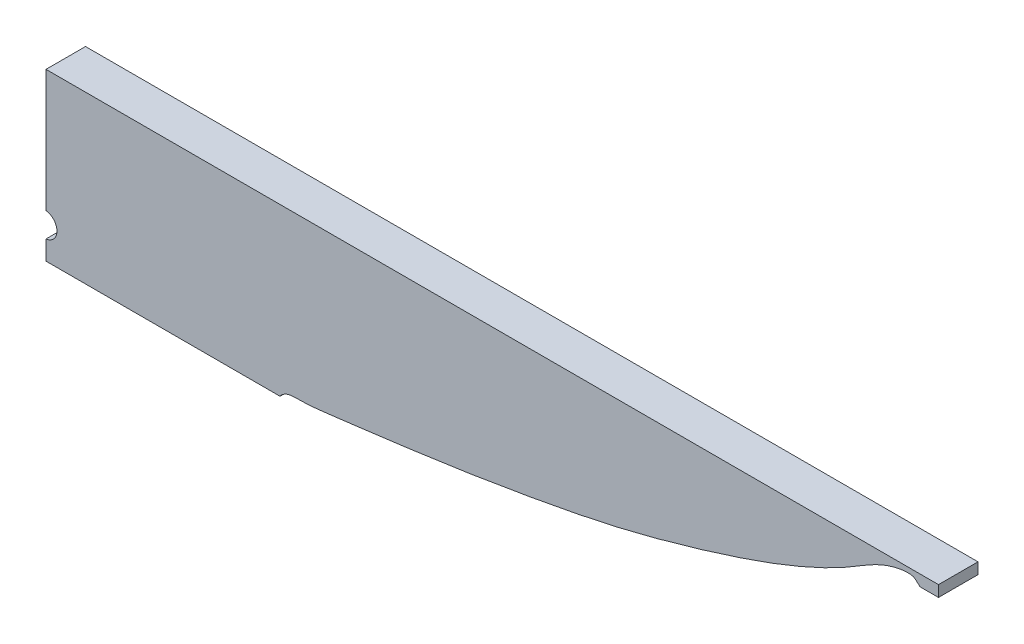
ISO-10303-21;
HEADER;
FILE_DESCRIPTION(('STEP AP214'),'2;1');
FILE_NAME('part.step','',(''),(''),'','','');
FILE_SCHEMA(('AUTOMOTIVE_DESIGN { 1 0 10303 214 1 1 1 1 }'));
ENDSEC;
DATA;
#1=APPLICATION_CONTEXT('core data for automotive mechanical design processes');
#2=APPLICATION_PROTOCOL_DEFINITION('international standard','automotive_design',2000,#1);
#3=PRODUCT_CONTEXT('',#1,'mechanical');
#4=PRODUCT('Part','Part','',(#3));
#5=PRODUCT_RELATED_PRODUCT_CATEGORY('part','',(#4));
#6=PRODUCT_DEFINITION_FORMATION('','',#4);
#7=PRODUCT_DEFINITION_CONTEXT('part definition',#1,'design');
#8=PRODUCT_DEFINITION('design','',#6,#7);
#9=PRODUCT_DEFINITION_SHAPE('','',#8);
#10=(LENGTH_UNIT() NAMED_UNIT(*) SI_UNIT(.MILLI.,.METRE.));
#11=(NAMED_UNIT(*) PLANE_ANGLE_UNIT() SI_UNIT($,.RADIAN.));
#12=(NAMED_UNIT(*) SI_UNIT($,.STERADIAN.) SOLID_ANGLE_UNIT());
#13=UNCERTAINTY_MEASURE_WITH_UNIT(LENGTH_MEASURE(1.E-05),#10,'distance_accuracy_value','');
#14=(GEOMETRIC_REPRESENTATION_CONTEXT(3) GLOBAL_UNCERTAINTY_ASSIGNED_CONTEXT((#13)) GLOBAL_UNIT_ASSIGNED_CONTEXT((#10,
#11,#12)) REPRESENTATION_CONTEXT('',''));
#15=CARTESIAN_POINT('',(0.,0.,0.));
#16=DIRECTION('',(0.,0.,1.));
#17=DIRECTION('',(1.,0.,0.));
#18=AXIS2_PLACEMENT_3D('',#15,#16,#17);
#19=CARTESIAN_POINT('',(-99.715552913143,-31.3833561952627,340.));
#20=DIRECTION('',(1.,0.,0.));
#21=DIRECTION('',(0.,1.,0.));
#22=AXIS2_PLACEMENT_3D('',#19,#20,#21);
#23=PLANE('',#22);
#24=DIRECTION('',(0.,-1.,0.));
#25=VECTOR('',#24,1.);
#26=CARTESIAN_POINT('',(-99.715552913143,-31.3833561952627,332.));
#27=LINE('',#26,#25);
#28=CARTESIAN_POINT('',(-99.7155529131445,2.25600000000002,332.));
#29=VERTEX_POINT('',#28);
#30=CARTESIAN_POINT('',(-99.7155529131434,-22.5162347424165,332.));
#31=VERTEX_POINT('',#30);
#32=EDGE_CURVE('E249',#29,#31,#27,.T.);
#33=ORIENTED_EDGE('',*,*,#32,.T.);
#34=DIRECTION('',(0.,0.,1.));
#35=VECTOR('',#34,1.);
#36=CARTESIAN_POINT('',(-99.7155529131434,-22.5162347424165,308.));
#37=LINE('',#36,#35);
#38=CARTESIAN_POINT('',(-99.7155529131434,-22.5162347424165,340.));
#39=VERTEX_POINT('',#38);
#40=EDGE_CURVE('E48',#31,#39,#37,.T.);
#41=ORIENTED_EDGE('',*,*,#40,.T.);
#42=DIRECTION('',(0.,-1.,0.));
#43=VECTOR('',#42,1.);
#44=CARTESIAN_POINT('',(-99.715552913143,-31.3833561952627,340.));
#45=LINE('',#44,#43);
#46=CARTESIAN_POINT('',(-99.7155529131445,2.25600000000002,340.));
#47=VERTEX_POINT('',#46);
#48=EDGE_CURVE('E110',#47,#39,#45,.T.);
#49=ORIENTED_EDGE('',*,*,#48,.F.);
#50=DIRECTION('',(0.,0.,-1.));
#51=VECTOR('',#50,1.);
#52=CARTESIAN_POINT('',(-99.7155529131445,2.25600000000002,340.));
#53=LINE('',#52,#51);
#54=EDGE_CURVE('E118',#47,#29,#53,.T.);
#55=ORIENTED_EDGE('',*,*,#54,.T.);
#56=EDGE_LOOP('',(#33,#41,#49,#55));
#57=FACE_BOUND('',#56,.T.);
#58=ADVANCED_FACE('F30',(#57),#23,.F.);
#59=CARTESIAN_POINT('',(-52.3272502786354,-31.3827697241907,340.));
#60=CARTESIAN_POINT('',(-52.3019884324153,-31.2969959954433,340.));
#61=CARTESIAN_POINT('',(-52.2510294920231,-31.2214637600181,340.));
#62=CARTESIAN_POINT('',(-52.1306502574105,-31.090701118863,340.));
#63=CARTESIAN_POINT('',(-52.0631045876463,-31.0327108940605,340.));
#64=CARTESIAN_POINT('',(-51.8576423509928,-30.8623788784455,340.));
#65=CARTESIAN_POINT('',(-51.7199084373645,-30.7498702787553,340.));
#66=CARTESIAN_POINT('',(-51.426859378234,-30.5490812323631,340.));
#67=CARTESIAN_POINT('',(-51.2709453750391,-30.4588355837759,340.));
#68=CARTESIAN_POINT('',(-50.9481445110749,-30.3195746832623,340.));
#69=CARTESIAN_POINT('',(-50.7813729098261,-30.2672465714669,340.));
#70=CARTESIAN_POINT('',(-50.2703245053053,-30.14483876575,340.));
#71=CARTESIAN_POINT('',(-49.9157778011306,-30.1079661032342,340.));
#72=CARTESIAN_POINT('',(-49.212680404316,-30.0630187397424,340.));
#73=CARTESIAN_POINT('',(-48.8603808214018,-30.0575005290863,340.));
#74=CARTESIAN_POINT('',(-48.1556154953519,-30.050216115977,340.));
#75=CARTESIAN_POINT('',(-47.8032070134301,-30.045812950502,340.));
#76=CARTESIAN_POINT('',(-47.0995059227388,-30.0208724890715,340.));
#77=CARTESIAN_POINT('',(-46.7480740175179,-30.0027163720569,340.));
#78=CARTESIAN_POINT('',(-45.6949487993763,-29.9323505581936,340.));
#79=CARTESIAN_POINT('',(-44.9944962056809,-29.8632896614089,340.));
#80=CARTESIAN_POINT('',(-43.5950006136815,-29.7060230256475,340.));
#81=CARTESIAN_POINT('',(-42.8961027312229,-29.6201713744207,340.));
#82=CARTESIAN_POINT('',(-41.4980174461401,-29.4510897010541,340.));
#83=CARTESIAN_POINT('',(-40.7990741939679,-29.3657342211435,340.));
#84=CARTESIAN_POINT('',(-38.7026197819837,-29.1065913074638,340.));
#85=CARTESIAN_POINT('',(-37.3054828160542,-28.9297260793651,340.));
#86=CARTESIAN_POINT('',(-30.3203126993804,-28.0415688005213,340.));
#87=CARTESIAN_POINT('',(-24.7328662119518,-27.3235012531114,340.));
#88=CARTESIAN_POINT('',(-16.3694038635395,-26.1203051056439,340.));
#89=CARTESIAN_POINT('',(-13.5847645751322,-25.6971272198141,340.));
#90=CARTESIAN_POINT('',(-8.02374958291194,-24.802751810992,340.));
#91=CARTESIAN_POINT('',(-5.24692142333589,-24.3332639725061,340.));
#92=CARTESIAN_POINT('',(0.300801715395404,-23.3583278125374,340.));
#93=CARTESIAN_POINT('',(3.0717862145152,-22.8532016858624,340.));
#94=CARTESIAN_POINT('',(8.60129266739322,-21.7841953682263,340.));
#95=CARTESIAN_POINT('',(11.3598853814276,-21.2194371193625,340.));
#96=CARTESIAN_POINT('',(16.8571147145289,-19.9919136036226,340.));
#97=CARTESIAN_POINT('',(19.5954808987058,-19.3280654266205,340.));
#98=CARTESIAN_POINT('',(25.0442670796501,-17.9056169306788,340.));
#99=CARTESIAN_POINT('',(27.7562073613432,-17.1485075816995,340.));
#100=CARTESIAN_POINT('',(33.1621733381757,-15.5682786664374,340.));
#101=CARTESIAN_POINT('',(35.8555168853719,-14.7422863430019,340.));
#102=CARTESIAN_POINT('',(41.2146464856652,-13.0075678728659,340.));
#103=CARTESIAN_POINT('',(43.8821393008736,-12.101339766008,340.));
#104=CARTESIAN_POINT('',(47.8466984728157,-10.6432138819539,340.));
#105=CARTESIAN_POINT('',(49.1628016640629,-10.1400909763772,340.));
#106=CARTESIAN_POINT('',(51.775823690343,-9.09161315919485,340.));
#107=CARTESIAN_POINT('',(53.0718838434992,-8.54591149351347,340.));
#108=CARTESIAN_POINT('',(55.6433578940863,-7.41210729063058,340.));
#109=CARTESIAN_POINT('',(56.919014684114,-6.82450357790945,340.));
#110=CARTESIAN_POINT('',(59.4434073906102,-5.59400920280514,340.));
#111=CARTESIAN_POINT('',(60.6918170069734,-4.95044842332999,340.));
#112=CARTESIAN_POINT('',(62.5333153984651,-3.92120477527265,340.));
#113=CARTESIAN_POINT('',(63.1421489651842,-3.56785672295101,340.));
#114=CARTESIAN_POINT('',(64.3545654694534,-2.85037748863225,340.));
#115=CARTESIAN_POINT('',(64.9573385805393,-2.48454769977814,340.));
#116=CARTESIAN_POINT('',(66.7709210505985,-1.39812943723909,340.));
#117=CARTESIAN_POINT('',(67.9883408901442,-0.691611535507576,340.));
#118=CARTESIAN_POINT('',(69.915274346982,0.154130829341781,340.));
#119=CARTESIAN_POINT('',(70.5750215093673,0.399023417192298,340.));
#120=CARTESIAN_POINT('',(71.591258217337,0.709849150694,340.));
#121=CARTESIAN_POINT('',(71.935365580292,0.8045941353554,340.));
#122=CARTESIAN_POINT('',(72.6265336896471,0.971732304141805,340.));
#123=CARTESIAN_POINT('',(72.9737903956955,1.04391888817592,340.));
#124=CARTESIAN_POINT('',(73.6721209127614,1.16231641096693,340.));
#125=CARTESIAN_POINT('',(74.0231429335477,1.20887978558425,340.));
#126=CARTESIAN_POINT('',(74.5554494103909,1.23943617774483,340.));
#127=CARTESIAN_POINT('',(74.7338086857951,1.24333523812031,340.));
#128=CARTESIAN_POINT('',(75.0927894856767,1.23573860815497,340.));
#129=CARTESIAN_POINT('',(75.2715585356191,1.22354384403631,340.));
#130=CARTESIAN_POINT('',(75.6240193159501,1.16902089234046,340.));
#131=CARTESIAN_POINT('',(75.8007121559411,1.12515059816222,340.));
#132=CARTESIAN_POINT('',(76.1310343218241,0.986553759106768,340.));
#133=CARTESIAN_POINT('',(76.2805633356021,0.889113688015156,340.));
#134=CARTESIAN_POINT('',(76.5626221993794,0.664580013545955,340.));
#135=CARTESIAN_POINT('',(76.6914801589952,0.539175678150931,340.));
#136=CARTESIAN_POINT('',(76.8904638789848,0.357218097927206,340.));
#137=CARTESIAN_POINT('',(76.9570095269587,0.29680059419744,340.));
#138=CARTESIAN_POINT('',(77.0778595877811,0.162752788784381,340.));
#139=CARTESIAN_POINT('',(77.1291278446639,0.0871817104850022,340.));
#140=CARTESIAN_POINT('',(77.1546689252611,0.,340.));
#141=B_SPLINE_CURVE_WITH_KNOTS('',3,(#59,#60,#61,#62,#63,#64,#65,#66,#67,#68,#69,#70,#71,#72,
#73,#74,#75,#76,#77,#78,#79,#80,#81,#82,#83,#84,#85,#86,#87,#88,#89,#90,#91,#92,#93,#94,#95,#96,
#97,#98,#99,#100,#101,#102,#103,#104,#105,#106,#107,#108,#109,#110,#111,#112,#113,#114,#115,
#116,#117,#118,#119,#120,#121,#122,#123,#124,#125,#126,#127,#128,#129,#130,#131,#132,#133,#134,
#135,#136,#137,#138,#139,#140),.UNSPECIFIED.,.F.,.F.,(4,2,2,2,2,2,2,2,2,2,2,2,2,2,2,2,2,2,2,2,2,
2,2,2,2,2,2,2,2,2,2,2,2,2,2,2,2,2,2,2,4),(0.,0.00195312500000011,0.00390625000000022,
0.00781250000000022,0.0117187500000002,0.0156250000000002,0.0234375000000001,0.03125,
0.0390624999999999,0.0468749999999998,0.0624999999999998,0.0781249999999998,0.0937499999999998,
0.125,0.25,0.3125,0.375,0.4375,0.499999999999999,0.562499999999999,0.624999999999999,
0.687499999999999,0.75,0.78125,0.8125,0.84375,0.875,0.890625,0.90625,0.9375,0.953125,0.9609375,
0.96875,0.9765625,0.98046875,0.984375,0.98828125,0.9921875,0.99609375,0.998046875,1.),.UNSPECIFIED.);
#142=DIRECTION('',(0.,0.,-1.));
#143=VECTOR('',#142,1.);
#144=SURFACE_OF_LINEAR_EXTRUSION('',#141,#143);
#145=CARTESIAN_POINT('',(-52.3272502786354,-31.3827697241907,332.));
#146=CARTESIAN_POINT('',(-52.3019884324153,-31.2969959954433,332.));
#147=CARTESIAN_POINT('',(-52.2510294920231,-31.2214637600181,332.));
#148=CARTESIAN_POINT('',(-52.1306502574105,-31.090701118863,332.));
#149=CARTESIAN_POINT('',(-52.0631045876463,-31.0327108940605,332.));
#150=CARTESIAN_POINT('',(-51.8576423509928,-30.8623788784455,332.));
#151=CARTESIAN_POINT('',(-51.7199084373645,-30.7498702787553,332.));
#152=CARTESIAN_POINT('',(-51.426859378234,-30.5490812323631,332.));
#153=CARTESIAN_POINT('',(-51.2709453750391,-30.4588355837759,332.));
#154=CARTESIAN_POINT('',(-50.9481445110749,-30.3195746832623,332.));
#155=CARTESIAN_POINT('',(-50.7813729098261,-30.2672465714669,332.));
#156=CARTESIAN_POINT('',(-50.2703245053053,-30.14483876575,332.));
#157=CARTESIAN_POINT('',(-49.9157778011306,-30.1079661032342,332.));
#158=CARTESIAN_POINT('',(-49.212680404316,-30.0630187397424,332.));
#159=CARTESIAN_POINT('',(-48.8603808214018,-30.0575005290863,332.));
#160=CARTESIAN_POINT('',(-48.1556154953519,-30.050216115977,332.));
#161=CARTESIAN_POINT('',(-47.8032070134301,-30.045812950502,332.));
#162=CARTESIAN_POINT('',(-47.0995059227388,-30.0208724890715,332.));
#163=CARTESIAN_POINT('',(-46.7480740175179,-30.0027163720569,332.));
#164=CARTESIAN_POINT('',(-45.6949487993763,-29.9323505581936,332.));
#165=CARTESIAN_POINT('',(-44.9944962056809,-29.8632896614089,332.));
#166=CARTESIAN_POINT('',(-43.5950006136815,-29.7060230256475,332.));
#167=CARTESIAN_POINT('',(-42.8961027312229,-29.6201713744207,332.));
#168=CARTESIAN_POINT('',(-41.4980174461401,-29.4510897010541,332.));
#169=CARTESIAN_POINT('',(-40.7990741939679,-29.3657342211435,332.));
#170=CARTESIAN_POINT('',(-38.7026197819837,-29.1065913074638,332.));
#171=CARTESIAN_POINT('',(-37.3054828160542,-28.9297260793651,332.));
#172=CARTESIAN_POINT('',(-30.3203126993804,-28.0415688005213,332.));
#173=CARTESIAN_POINT('',(-24.7328662119518,-27.3235012531114,332.));
#174=CARTESIAN_POINT('',(-16.3694038635395,-26.1203051056439,332.));
#175=CARTESIAN_POINT('',(-13.5847645751322,-25.6971272198141,332.));
#176=CARTESIAN_POINT('',(-8.02374958291194,-24.802751810992,332.));
#177=CARTESIAN_POINT('',(-5.24692142333589,-24.3332639725061,332.));
#178=CARTESIAN_POINT('',(0.300801715395404,-23.3583278125374,332.));
#179=CARTESIAN_POINT('',(3.0717862145152,-22.8532016858624,332.));
#180=CARTESIAN_POINT('',(8.60129266739322,-21.7841953682263,332.));
#181=CARTESIAN_POINT('',(11.3598853814276,-21.2194371193625,332.));
#182=CARTESIAN_POINT('',(16.8571147145289,-19.9919136036226,332.));
#183=CARTESIAN_POINT('',(19.5954808987058,-19.3280654266205,332.));
#184=CARTESIAN_POINT('',(25.0442670796501,-17.9056169306788,332.));
#185=CARTESIAN_POINT('',(27.7562073613432,-17.1485075816995,332.));
#186=CARTESIAN_POINT('',(33.1621733381757,-15.5682786664374,332.));
#187=CARTESIAN_POINT('',(35.8555168853719,-14.7422863430019,332.));
#188=CARTESIAN_POINT('',(41.2146464856652,-13.0075678728659,332.));
#189=CARTESIAN_POINT('',(43.8821393008736,-12.101339766008,332.));
#190=CARTESIAN_POINT('',(47.8466984728157,-10.6432138819539,332.));
#191=CARTESIAN_POINT('',(49.1628016640629,-10.1400909763772,332.));
#192=CARTESIAN_POINT('',(51.775823690343,-9.09161315919485,332.));
#193=CARTESIAN_POINT('',(53.0718838434992,-8.54591149351347,332.));
#194=CARTESIAN_POINT('',(55.6433578940863,-7.41210729063058,332.));
#195=CARTESIAN_POINT('',(56.919014684114,-6.82450357790945,332.));
#196=CARTESIAN_POINT('',(59.4434073906102,-5.59400920280514,332.));
#197=CARTESIAN_POINT('',(60.6918170069734,-4.95044842332999,332.));
#198=CARTESIAN_POINT('',(62.5333153984651,-3.92120477527265,332.));
#199=CARTESIAN_POINT('',(63.1421489651842,-3.56785672295101,332.));
#200=CARTESIAN_POINT('',(64.3545654694534,-2.85037748863225,332.));
#201=CARTESIAN_POINT('',(64.9573385805393,-2.48454769977814,332.));
#202=CARTESIAN_POINT('',(66.7709210505985,-1.39812943723909,332.));
#203=CARTESIAN_POINT('',(67.9883408901442,-0.691611535507576,332.));
#204=CARTESIAN_POINT('',(69.915274346982,0.154130829341781,332.));
#205=CARTESIAN_POINT('',(70.5750215093673,0.399023417192298,332.));
#206=CARTESIAN_POINT('',(71.591258217337,0.709849150694,332.));
#207=CARTESIAN_POINT('',(71.935365580292,0.8045941353554,332.));
#208=CARTESIAN_POINT('',(72.6265336896471,0.971732304141805,332.));
#209=CARTESIAN_POINT('',(72.9737903956955,1.04391888817592,332.));
#210=CARTESIAN_POINT('',(73.6721209127614,1.16231641096693,332.));
#211=CARTESIAN_POINT('',(74.0231429335477,1.20887978558425,332.));
#212=CARTESIAN_POINT('',(74.5554494103909,1.23943617774483,332.));
#213=CARTESIAN_POINT('',(74.7338086857951,1.24333523812031,332.));
#214=CARTESIAN_POINT('',(75.0927894856767,1.23573860815497,332.));
#215=CARTESIAN_POINT('',(75.2715585356191,1.22354384403631,332.));
#216=CARTESIAN_POINT('',(75.6240193159501,1.16902089234046,332.));
#217=CARTESIAN_POINT('',(75.8007121559411,1.12515059816222,332.));
#218=CARTESIAN_POINT('',(76.1310343218241,0.986553759106768,332.));
#219=CARTESIAN_POINT('',(76.2805633356021,0.889113688015156,332.));
#220=CARTESIAN_POINT('',(76.5626221993794,0.664580013545955,332.));
#221=CARTESIAN_POINT('',(76.6914801589952,0.539175678150931,332.));
#222=CARTESIAN_POINT('',(76.8904638789848,0.357218097927206,332.));
#223=CARTESIAN_POINT('',(76.9570095269587,0.29680059419744,332.));
#224=CARTESIAN_POINT('',(77.0778595877811,0.162752788784381,332.));
#225=CARTESIAN_POINT('',(77.1291278446639,0.0871817104850022,332.));
#226=CARTESIAN_POINT('',(77.1546689252611,0.,332.));
#227=B_SPLINE_CURVE_WITH_KNOTS('',3,(#145,#146,#147,#148,#149,#150,#151,#152,#153,#154,#155,
#156,#157,#158,#159,#160,#161,#162,#163,#164,#165,#166,#167,#168,#169,#170,#171,#172,#173,#174,
#175,#176,#177,#178,#179,#180,#181,#182,#183,#184,#185,#186,#187,#188,#189,#190,#191,#192,#193,
#194,#195,#196,#197,#198,#199,#200,#201,#202,#203,#204,#205,#206,#207,#208,#209,#210,#211,#212,
#213,#214,#215,#216,#217,#218,#219,#220,#221,#222,#223,#224,#225,#226),.UNSPECIFIED.,.F.,.F.,(4,
2,2,2,2,2,2,2,2,2,2,2,2,2,2,2,2,2,2,2,2,2,2,2,2,2,2,2,2,2,2,2,2,2,2,2,2,2,2,2,4),(0.,
0.00195312500000011,0.00390625000000022,0.00781250000000022,0.0117187500000002,
0.0156250000000002,0.0234375000000001,0.03125,0.0390624999999999,0.0468749999999998,
0.0624999999999998,0.0781249999999998,0.0937499999999998,0.125,0.25,0.3125,0.375,0.4375,
0.499999999999999,0.562499999999999,0.624999999999999,0.687499999999999,0.75,0.78125,0.8125,
0.84375,0.875,0.890625,0.90625,0.9375,0.953125,0.9609375,0.96875,0.9765625,0.98046875,0.984375,
0.98828125,0.9921875,0.99609375,0.998046875,1.),.UNSPECIFIED.);
#228=CARTESIAN_POINT('',(-52.3272502786354,-31.3827697241907,332.));
#229=VERTEX_POINT('',#228);
#230=CARTESIAN_POINT('',(77.1546689252631,1.49874009687176E-13,332.));
#231=VERTEX_POINT('',#230);
#232=EDGE_CURVE('E227',#229,#231,#227,.T.);
#233=ORIENTED_EDGE('',*,*,#232,.T.);
#234=DIRECTION('',(0.,0.,-1.));
#235=VECTOR('',#234,1.);
#236=CARTESIAN_POINT('',(77.1546689252631,1.49874009687176E-13,340.));
#237=LINE('',#236,#235);
#238=CARTESIAN_POINT('',(77.1546689252631,1.49874009687176E-13,340.));
#239=VERTEX_POINT('',#238);
#240=EDGE_CURVE('E42',#239,#231,#237,.T.);
#241=ORIENTED_EDGE('',*,*,#240,.F.);
#242=CARTESIAN_POINT('',(77.1546689252611,0.,340.));
#243=CARTESIAN_POINT('',(77.1291278446639,0.0871817104850022,340.));
#244=CARTESIAN_POINT('',(77.0778595877811,0.162752788784381,340.));
#245=CARTESIAN_POINT('',(76.9570095269587,0.29680059419744,340.));
#246=CARTESIAN_POINT('',(76.8904638789848,0.357218097927206,340.));
#247=CARTESIAN_POINT('',(76.6914801589952,0.539175678150931,340.));
#248=CARTESIAN_POINT('',(76.5626221993794,0.664580013545955,340.));
#249=CARTESIAN_POINT('',(76.2805633356021,0.889113688015156,340.));
#250=CARTESIAN_POINT('',(76.1310343218241,0.986553759106768,340.));
#251=CARTESIAN_POINT('',(75.8007121559411,1.12515059816222,340.));
#252=CARTESIAN_POINT('',(75.6240193159501,1.16902089234046,340.));
#253=CARTESIAN_POINT('',(75.2715585356191,1.22354384403631,340.));
#254=CARTESIAN_POINT('',(75.0927894856767,1.23573860815497,340.));
#255=CARTESIAN_POINT('',(74.7338086857951,1.24333523812031,340.));
#256=CARTESIAN_POINT('',(74.5554494103909,1.23943617774483,340.));
#257=CARTESIAN_POINT('',(74.0231429335477,1.20887978558425,340.));
#258=CARTESIAN_POINT('',(73.6721209127614,1.16231641096693,340.));
#259=CARTESIAN_POINT('',(72.9737903956955,1.04391888817592,340.));
#260=CARTESIAN_POINT('',(72.6265336896471,0.971732304141805,340.));
#261=CARTESIAN_POINT('',(71.935365580292,0.8045941353554,340.));
#262=CARTESIAN_POINT('',(71.591258217337,0.709849150694,340.));
#263=CARTESIAN_POINT('',(70.5750215093673,0.399023417192298,340.));
#264=CARTESIAN_POINT('',(69.915274346982,0.154130829341781,340.));
#265=CARTESIAN_POINT('',(67.9883408901442,-0.691611535507576,340.));
#266=CARTESIAN_POINT('',(66.7709210505985,-1.39812943723909,340.));
#267=CARTESIAN_POINT('',(64.9573385805393,-2.48454769977814,340.));
#268=CARTESIAN_POINT('',(64.3545654694534,-2.85037748863225,340.));
#269=CARTESIAN_POINT('',(63.1421489651842,-3.56785672295101,340.));
#270=CARTESIAN_POINT('',(62.5333153984651,-3.92120477527265,340.));
#271=CARTESIAN_POINT('',(60.6918170069734,-4.95044842332999,340.));
#272=CARTESIAN_POINT('',(59.4434073906102,-5.59400920280514,340.));
#273=CARTESIAN_POINT('',(56.919014684114,-6.82450357790945,340.));
#274=CARTESIAN_POINT('',(55.6433578940863,-7.41210729063058,340.));
#275=CARTESIAN_POINT('',(53.0718838434992,-8.54591149351347,340.));
#276=CARTESIAN_POINT('',(51.775823690343,-9.09161315919485,340.));
#277=CARTESIAN_POINT('',(49.1628016640629,-10.1400909763772,340.));
#278=CARTESIAN_POINT('',(47.8466984728157,-10.6432138819539,340.));
#279=CARTESIAN_POINT('',(43.8821393008736,-12.101339766008,340.));
#280=CARTESIAN_POINT('',(41.2146464856652,-13.0075678728659,340.));
#281=CARTESIAN_POINT('',(35.8555168853719,-14.7422863430019,340.));
#282=CARTESIAN_POINT('',(33.1621733381757,-15.5682786664374,340.));
#283=CARTESIAN_POINT('',(27.7562073613432,-17.1485075816995,340.));
#284=CARTESIAN_POINT('',(25.0442670796501,-17.9056169306788,340.));
#285=CARTESIAN_POINT('',(19.5954808987058,-19.3280654266205,340.));
#286=CARTESIAN_POINT('',(16.8571147145289,-19.9919136036226,340.));
#287=CARTESIAN_POINT('',(11.3598853814276,-21.2194371193625,340.));
#288=CARTESIAN_POINT('',(8.60129266739322,-21.7841953682263,340.));
#289=CARTESIAN_POINT('',(3.0717862145152,-22.8532016858624,340.));
#290=CARTESIAN_POINT('',(0.300801715395404,-23.3583278125374,340.));
#291=CARTESIAN_POINT('',(-5.24692142333589,-24.3332639725061,340.));
#292=CARTESIAN_POINT('',(-8.02374958291194,-24.802751810992,340.));
#293=CARTESIAN_POINT('',(-13.5847645751322,-25.6971272198141,340.));
#294=CARTESIAN_POINT('',(-16.3694038635395,-26.1203051056439,340.));
#295=CARTESIAN_POINT('',(-24.7328662119518,-27.3235012531114,340.));
#296=CARTESIAN_POINT('',(-30.3203126993804,-28.0415688005213,340.));
#297=CARTESIAN_POINT('',(-37.3054828160542,-28.9297260793651,340.));
#298=CARTESIAN_POINT('',(-38.7026197819837,-29.1065913074638,340.));
#299=CARTESIAN_POINT('',(-40.7990741939679,-29.3657342211435,340.));
#300=CARTESIAN_POINT('',(-41.4980174461401,-29.4510897010541,340.));
#301=CARTESIAN_POINT('',(-42.8961027312229,-29.6201713744207,340.));
#302=CARTESIAN_POINT('',(-43.5950006136815,-29.7060230256475,340.));
#303=CARTESIAN_POINT('',(-44.9944962056809,-29.8632896614089,340.));
#304=CARTESIAN_POINT('',(-45.6949487993763,-29.9323505581936,340.));
#305=CARTESIAN_POINT('',(-46.7480740175179,-30.0027163720569,340.));
#306=CARTESIAN_POINT('',(-47.0995059227388,-30.0208724890715,340.));
#307=CARTESIAN_POINT('',(-47.8032070134301,-30.045812950502,340.));
#308=CARTESIAN_POINT('',(-48.1556154953519,-30.050216115977,340.));
#309=CARTESIAN_POINT('',(-48.8603808214018,-30.0575005290863,340.));
#310=CARTESIAN_POINT('',(-49.212680404316,-30.0630187397424,340.));
#311=CARTESIAN_POINT('',(-49.9157778011306,-30.1079661032342,340.));
#312=CARTESIAN_POINT('',(-50.2703245053053,-30.14483876575,340.));
#313=CARTESIAN_POINT('',(-50.7813729098261,-30.2672465714669,340.));
#314=CARTESIAN_POINT('',(-50.9481445110749,-30.3195746832623,340.));
#315=CARTESIAN_POINT('',(-51.2709453750391,-30.4588355837759,340.));
#316=CARTESIAN_POINT('',(-51.426859378234,-30.5490812323631,340.));
#317=CARTESIAN_POINT('',(-51.7199084373645,-30.7498702787553,340.));
#318=CARTESIAN_POINT('',(-51.8576423509928,-30.8623788784455,340.));
#319=CARTESIAN_POINT('',(-52.0631045876463,-31.0327108940605,340.));
#320=CARTESIAN_POINT('',(-52.1306502574105,-31.090701118863,340.));
#321=CARTESIAN_POINT('',(-52.2510294920231,-31.2214637600181,340.));
#322=CARTESIAN_POINT('',(-52.3019884324153,-31.2969959954433,340.));
#323=CARTESIAN_POINT('',(-52.3272502786354,-31.3827697241907,340.));
#324=B_SPLINE_CURVE_WITH_KNOTS('',3,(#242,#243,#244,#245,#246,#247,#248,#249,#250,#251,#252,
#253,#254,#255,#256,#257,#258,#259,#260,#261,#262,#263,#264,#265,#266,#267,#268,#269,#270,#271,
#272,#273,#274,#275,#276,#277,#278,#279,#280,#281,#282,#283,#284,#285,#286,#287,#288,#289,#290,
#291,#292,#293,#294,#295,#296,#297,#298,#299,#300,#301,#302,#303,#304,#305,#306,#307,#308,#309,
#310,#311,#312,#313,#314,#315,#316,#317,#318,#319,#320,#321,#322,#323),.UNSPECIFIED.,.F.,.F.,(4,
2,2,2,2,2,2,2,2,2,2,2,2,2,2,2,2,2,2,2,2,2,2,2,2,2,2,2,2,2,2,2,2,2,2,2,2,2,2,2,4),(0.,
0.001953125,0.00390625,0.0078125,0.01171875,0.015625,0.01953125,0.0234375,0.03125,0.0390625,
0.046875,0.0625,0.09375,0.109375,0.125,0.15625,0.1875,0.21875,0.25,0.312500000000001,
0.375000000000001,0.437500000000001,0.500000000000001,0.5625,0.625,0.6875,0.75,0.875,0.90625,
0.921875,0.9375,0.953125,0.9609375,0.96875,0.9765625,0.984375,0.98828125,0.9921875,0.99609375,
0.998046875,1.),.UNSPECIFIED.);
#325=CARTESIAN_POINT('',(-52.3272502786354,-31.3827697241907,340.));
#326=VERTEX_POINT('',#325);
#327=EDGE_CURVE('E209',#326,#239,#324,.F.);
#328=ORIENTED_EDGE('',*,*,#327,.F.);
#329=DIRECTION('',(0.,0.,-1.));
#330=VECTOR('',#329,1.);
#331=CARTESIAN_POINT('',(-52.3272502786354,-31.3827697241907,340.));
#332=LINE('',#331,#330);
#333=EDGE_CURVE('E129',#326,#229,#332,.T.);
#334=ORIENTED_EDGE('',*,*,#333,.T.);
#335=EDGE_LOOP('',(#233,#241,#328,#334));
#336=FACE_BOUND('',#335,.T.);
#337=ADVANCED_FACE('F32',(#336),#144,.F.);
#338=CARTESIAN_POINT('',(77.1546689252631,1.49874009687176E-13,340.));
#339=DIRECTION('',(0.,1.,0.));
#340=DIRECTION('',(-1.,0.,0.));
#341=AXIS2_PLACEMENT_3D('',#338,#339,#340);
#342=PLANE('',#341);
#343=DIRECTION('',(1.,0.,0.));
#344=VECTOR('',#343,1.);
#345=CARTESIAN_POINT('',(77.1546689252631,1.49874009687176E-13,332.));
#346=LINE('',#345,#344);
#347=CARTESIAN_POINT('',(80.9999285185176,0.,332.));
#348=VERTEX_POINT('',#347);
#349=EDGE_CURVE('E175',#231,#348,#346,.T.);
#350=ORIENTED_EDGE('',*,*,#349,.T.);
#351=DIRECTION('',(0.,0.,-1.));
#352=VECTOR('',#351,1.);
#353=CARTESIAN_POINT('',(80.9999285185176,0.,340.));
#354=LINE('',#353,#352);
#355=CARTESIAN_POINT('',(80.9999285185176,0.,340.));
#356=VERTEX_POINT('',#355);
#357=EDGE_CURVE('E179',#356,#348,#354,.T.);
#358=ORIENTED_EDGE('',*,*,#357,.F.);
#359=DIRECTION('',(1.,0.,0.));
#360=VECTOR('',#359,1.);
#361=CARTESIAN_POINT('',(77.1546689252631,1.49874009687176E-13,340.));
#362=LINE('',#361,#360);
#363=EDGE_CURVE('E95',#239,#356,#362,.T.);
#364=ORIENTED_EDGE('',*,*,#363,.F.);
#365=ORIENTED_EDGE('',*,*,#240,.T.);
#366=EDGE_LOOP('',(#350,#358,#364,#365));
#367=FACE_BOUND('',#366,.T.);
#368=ADVANCED_FACE('F260',(#367),#342,.F.);
#369=CARTESIAN_POINT('',(80.9999285185176,2.25600000000004,340.));
#370=DIRECTION('',(-1.,0.,0.));
#371=DIRECTION('',(0.,-1.,0.));
#372=AXIS2_PLACEMENT_3D('',#369,#370,#371);
#373=PLANE('',#372);
#374=DIRECTION('',(0.,1.,0.));
#375=VECTOR('',#374,1.);
#376=CARTESIAN_POINT('',(80.9999285185176,2.25600000000004,332.));
#377=LINE('',#376,#375);
#378=CARTESIAN_POINT('',(80.9999285185176,2.25600000000004,332.));
#379=VERTEX_POINT('',#378);
#380=EDGE_CURVE('E170',#348,#379,#377,.T.);
#381=ORIENTED_EDGE('',*,*,#380,.T.);
#382=DIRECTION('',(0.,0.,-1.));
#383=VECTOR('',#382,1.);
#384=CARTESIAN_POINT('',(80.9999285185176,2.25600000000004,340.));
#385=LINE('',#384,#383);
#386=CARTESIAN_POINT('',(80.9999285185176,2.25600000000004,340.));
#387=VERTEX_POINT('',#386);
#388=EDGE_CURVE('E125',#387,#379,#385,.T.);
#389=ORIENTED_EDGE('',*,*,#388,.F.);
#390=DIRECTION('',(0.,1.,0.));
#391=VECTOR('',#390,1.);
#392=CARTESIAN_POINT('',(80.9999285185176,2.25600000000004,340.));
#393=LINE('',#392,#391);
#394=EDGE_CURVE('E112',#356,#387,#393,.T.);
#395=ORIENTED_EDGE('',*,*,#394,.F.);
#396=ORIENTED_EDGE('',*,*,#357,.T.);
#397=EDGE_LOOP('',(#381,#389,#395,#396));
#398=FACE_BOUND('',#397,.T.);
#399=ADVANCED_FACE('F263',(#398),#373,.F.);
#400=CARTESIAN_POINT('',(80.9999285185176,2.25600000000004,340.));
#401=DIRECTION('',(0.,-1.,0.));
#402=DIRECTION('',(1.,0.,0.));
#403=AXIS2_PLACEMENT_3D('',#400,#401,#402);
#404=PLANE('',#403);
#405=DIRECTION('',(-1.,0.,0.));
#406=VECTOR('',#405,1.);
#407=CARTESIAN_POINT('',(80.9999285185176,2.25600000000004,332.));
#408=LINE('',#407,#406);
#409=EDGE_CURVE('E121',#379,#29,#408,.T.);
#410=ORIENTED_EDGE('',*,*,#409,.T.);
#411=ORIENTED_EDGE('',*,*,#54,.F.);
#412=DIRECTION('',(-1.,0.,0.));
#413=VECTOR('',#412,1.);
#414=CARTESIAN_POINT('',(80.9999285185176,2.25600000000004,340.));
#415=LINE('',#414,#413);
#416=EDGE_CURVE('E105',#387,#47,#415,.T.);
#417=ORIENTED_EDGE('',*,*,#416,.F.);
#418=ORIENTED_EDGE('',*,*,#388,.T.);
#419=EDGE_LOOP('',(#410,#411,#417,#418));
#420=FACE_BOUND('',#419,.T.);
#421=ADVANCED_FACE('F119',(#420),#404,.F.);
#422=CARTESIAN_POINT('',(-99.7155529131432,-27.4837652575835,340.));
#423=VERTEX_POINT('',#422);
#424=CARTESIAN_POINT('',(-99.715552913143,-31.3833561952627,340.));
#425=VERTEX_POINT('',#424);
#426=EDGE_CURVE('E36',#423,#425,#45,.T.);
#427=ORIENTED_EDGE('',*,*,#426,.F.);
#428=DIRECTION('',(0.,0.,1.));
#429=VECTOR('',#428,1.);
#430=CARTESIAN_POINT('',(-99.7155529131432,-27.4837652575835,308.));
#431=LINE('',#430,#429);
#432=CARTESIAN_POINT('',(-99.7155529131432,-27.4837652575835,332.));
#433=VERTEX_POINT('',#432);
#434=EDGE_CURVE('E269',#423,#433,#431,.F.);
#435=ORIENTED_EDGE('',*,*,#434,.T.);
#436=CARTESIAN_POINT('',(-99.715552913143,-31.3833561952627,332.));
#437=VERTEX_POINT('',#436);
#438=EDGE_CURVE('E176',#433,#437,#27,.T.);
#439=ORIENTED_EDGE('',*,*,#438,.T.);
#440=DIRECTION('',(0.,0.,-1.));
#441=VECTOR('',#440,1.);
#442=CARTESIAN_POINT('',(-99.715552913143,-31.3833561952627,340.));
#443=LINE('',#442,#441);
#444=EDGE_CURVE('E126',#425,#437,#443,.T.);
#445=ORIENTED_EDGE('',*,*,#444,.F.);
#446=EDGE_LOOP('',(#427,#435,#439,#445));
#447=FACE_BOUND('',#446,.T.);
#448=ADVANCED_FACE('F159',(#447),#23,.F.);
#449=CARTESIAN_POINT('',(-99.7155529131445,-31.383356195265,340.));
#450=CARTESIAN_POINT('',(-83.919452034935,-31.3835484393856,340.));
#451=CARTESIAN_POINT('',(-68.1233511387106,-31.3835506609957,340.));
#452=CARTESIAN_POINT('',(-52.3272502786354,-31.3827697241907,340.));
#453=B_SPLINE_CURVE_WITH_KNOTS('',3,(#449,#450,#451,#452),.UNSPECIFIED.,.F.,.F.,(4,4),(0.,1.),.UNSPECIFIED.);
#454=DIRECTION('',(0.,0.,-1.));
#455=VECTOR('',#454,1.);
#456=SURFACE_OF_LINEAR_EXTRUSION('',#453,#455);
#457=CARTESIAN_POINT('',(-99.7155529131445,-31.383356195265,332.));
#458=CARTESIAN_POINT('',(-83.919452034935,-31.3835484393856,332.));
#459=CARTESIAN_POINT('',(-68.1233511387106,-31.3835506609957,332.));
#460=CARTESIAN_POINT('',(-52.3272502786354,-31.3827697241907,332.));
#461=B_SPLINE_CURVE_WITH_KNOTS('',3,(#457,#458,#459,#460),.UNSPECIFIED.,.F.,.F.,(4,4),(0.,1.),.UNSPECIFIED.);
#462=EDGE_CURVE('E85',#437,#229,#461,.T.);
#463=ORIENTED_EDGE('',*,*,#462,.T.);
#464=ORIENTED_EDGE('',*,*,#333,.F.);
#465=CARTESIAN_POINT('',(-52.3272502786354,-31.3827697241907,340.));
#466=CARTESIAN_POINT('',(-68.1233511387106,-31.3835506609957,340.));
#467=CARTESIAN_POINT('',(-83.919452034935,-31.3835484393856,340.));
#468=CARTESIAN_POINT('',(-99.7155529131445,-31.383356195265,340.));
#469=B_SPLINE_CURVE_WITH_KNOTS('',3,(#465,#466,#467,#468),.UNSPECIFIED.,.F.,.F.,(4,4),(0.,1.),.UNSPECIFIED.);
#470=EDGE_CURVE('E57',#425,#326,#469,.F.);
#471=ORIENTED_EDGE('',*,*,#470,.F.);
#472=ORIENTED_EDGE('',*,*,#444,.T.);
#473=EDGE_LOOP('',(#463,#464,#471,#472));
#474=FACE_BOUND('',#473,.T.);
#475=ADVANCED_FACE('F148',(#474),#456,.F.);
#476=CARTESIAN_POINT('',(14.1085000479783,-20.6056753614926,340.));
#477=DIRECTION('',(0.,0.,-1.));
#478=DIRECTION('',(-1.,0.,0.));
#479=AXIS2_PLACEMENT_3D('',#476,#477,#478);
#480=PLANE('',#479);
#481=ORIENTED_EDGE('',*,*,#48,.T.);
#482=CARTESIAN_POINT('',(-100.,-25.,340.));
#483=DIRECTION('',(0.,0.,-1.));
#484=DIRECTION('',(-1.,0.,0.));
#485=AXIS2_PLACEMENT_3D('',#482,#483,#484);
#486=CIRCLE('',#485,2.5);
#487=EDGE_CURVE('E275',#39,#423,#486,.T.);
#488=ORIENTED_EDGE('',*,*,#487,.T.);
#489=ORIENTED_EDGE('',*,*,#426,.T.);
#490=ORIENTED_EDGE('',*,*,#470,.T.);
#491=ORIENTED_EDGE('',*,*,#327,.T.);
#492=ORIENTED_EDGE('',*,*,#363,.T.);
#493=ORIENTED_EDGE('',*,*,#394,.T.);
#494=ORIENTED_EDGE('',*,*,#416,.T.);
#495=EDGE_LOOP('',(#481,#488,#489,#490,#491,#492,#493,#494));
#496=FACE_BOUND('',#495,.T.);
#497=ADVANCED_FACE('F107',(#496),#480,.F.);
#498=CARTESIAN_POINT('',(14.1085000479783,-20.6056753614926,332.));
#499=DIRECTION('',(0.,0.,-1.));
#500=DIRECTION('',(-1.,0.,0.));
#501=AXIS2_PLACEMENT_3D('',#498,#499,#500);
#502=PLANE('',#501);
#503=CARTESIAN_POINT('',(-100.,-25.,332.));
#504=DIRECTION('',(0.,0.,-1.));
#505=DIRECTION('',(-1.,0.,0.));
#506=AXIS2_PLACEMENT_3D('',#503,#504,#505);
#507=CIRCLE('',#506,2.5);
#508=EDGE_CURVE('E11',#31,#433,#507,.T.);
#509=ORIENTED_EDGE('',*,*,#508,.F.);
#510=ORIENTED_EDGE('',*,*,#32,.F.);
#511=ORIENTED_EDGE('',*,*,#409,.F.);
#512=ORIENTED_EDGE('',*,*,#380,.F.);
#513=ORIENTED_EDGE('',*,*,#349,.F.);
#514=ORIENTED_EDGE('',*,*,#232,.F.);
#515=ORIENTED_EDGE('',*,*,#462,.F.);
#516=ORIENTED_EDGE('',*,*,#438,.F.);
#517=EDGE_LOOP('',(#509,#510,#511,#512,#513,#514,#515,#516));
#518=FACE_BOUND('',#517,.T.);
#519=ADVANCED_FACE('F160',(#518),#502,.T.);
#520=CARTESIAN_POINT('',(-100.,-25.,308.));
#521=DIRECTION('',(0.,0.,1.));
#522=DIRECTION('',(1.,0.,0.));
#523=AXIS2_PLACEMENT_3D('',#520,#521,#522);
#524=CYLINDRICAL_SURFACE('',#523,2.5);
#525=ORIENTED_EDGE('',*,*,#40,.F.);
#526=ORIENTED_EDGE('',*,*,#508,.T.);
#527=ORIENTED_EDGE('',*,*,#434,.F.);
#528=ORIENTED_EDGE('',*,*,#487,.F.);
#529=EDGE_LOOP('',(#525,#526,#527,#528));
#530=FACE_BOUND('',#529,.T.);
#531=ADVANCED_FACE('F192',(#530),#524,.F.);
#532=CLOSED_SHELL('',(#58,#337,#368,#399,#421,#448,#475,#497,#519,#531));
#533=MANIFOLD_SOLID_BREP('B2',#532);
#534=ADVANCED_BREP_SHAPE_REPRESENTATION('',(#18,#533),#14);
#535=SHAPE_DEFINITION_REPRESENTATION(#9,#534);
ENDSEC;
END-ISO-10303-21;
